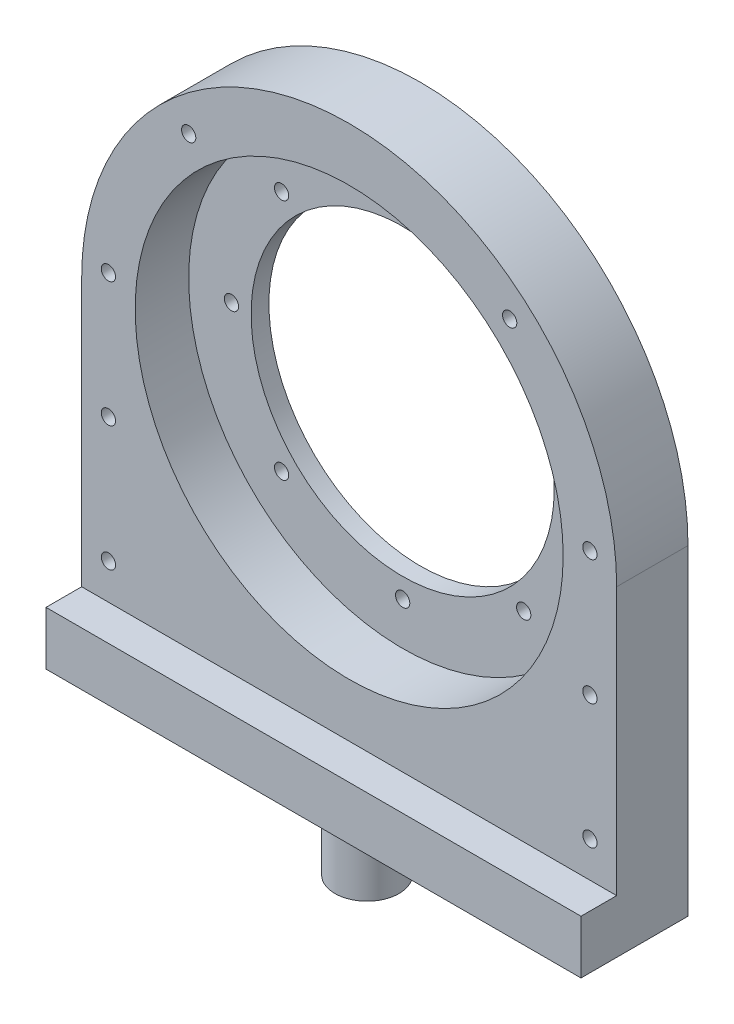
ISO-10303-21;
HEADER;
FILE_DESCRIPTION(('STEP AP214'),'2;1');
FILE_NAME('part.step','',(''),(''),'','','');
FILE_SCHEMA(('AUTOMOTIVE_DESIGN { 1 0 10303 214 1 1 1 1 }'));
ENDSEC;
DATA;
#1=APPLICATION_CONTEXT('core data for automotive mechanical design processes');
#2=APPLICATION_PROTOCOL_DEFINITION('international standard','automotive_design',2000,#1);
#3=PRODUCT_CONTEXT('',#1,'mechanical');
#4=PRODUCT('Part','Part','',(#3));
#5=PRODUCT_RELATED_PRODUCT_CATEGORY('part','',(#4));
#6=PRODUCT_DEFINITION_FORMATION('','',#4);
#7=PRODUCT_DEFINITION_CONTEXT('part definition',#1,'design');
#8=PRODUCT_DEFINITION('design','',#6,#7);
#9=PRODUCT_DEFINITION_SHAPE('','',#8);
#10=(LENGTH_UNIT() NAMED_UNIT(*) SI_UNIT(.MILLI.,.METRE.));
#11=(NAMED_UNIT(*) PLANE_ANGLE_UNIT() SI_UNIT($,.RADIAN.));
#12=(NAMED_UNIT(*) SI_UNIT($,.STERADIAN.) SOLID_ANGLE_UNIT());
#13=UNCERTAINTY_MEASURE_WITH_UNIT(LENGTH_MEASURE(1.E-05),#10,'distance_accuracy_value','');
#14=(GEOMETRIC_REPRESENTATION_CONTEXT(3) GLOBAL_UNCERTAINTY_ASSIGNED_CONTEXT((#13)) GLOBAL_UNIT_ASSIGNED_CONTEXT((#10,
#11,#12)) REPRESENTATION_CONTEXT('',''));
#15=CARTESIAN_POINT('',(0.,0.,0.));
#16=DIRECTION('',(0.,0.,1.));
#17=DIRECTION('',(1.,0.,0.));
#18=AXIS2_PLACEMENT_3D('',#15,#16,#17);
#19=CARTESIAN_POINT('',(75.,75.,-138.281535648995));
#20=DIRECTION('',(0.,0.,1.));
#21=DIRECTION('',(1.,0.,0.));
#22=AXIS2_PLACEMENT_3D('',#19,#20,#21);
#23=CYLINDRICAL_SURFACE('',#22,42.5);
#24=CARTESIAN_POINT('',(75.,75.,-8.2815356489945));
#25=DIRECTION('',(0.,0.,1.));
#26=DIRECTION('',(1.,0.,0.));
#27=AXIS2_PLACEMENT_3D('',#24,#25,#26);
#28=CIRCLE('',#27,42.5);
#29=CARTESIAN_POINT('',(117.5,75.,-8.2815356489945));
#30=VERTEX_POINT('',#29);
#31=EDGE_CURVE('E157',#30,#30,#28,.T.);
#32=ORIENTED_EDGE('',*,*,#31,.F.);
#33=EDGE_LOOP('',(#32));
#34=FACE_BOUND('',#33,.T.);
#35=CARTESIAN_POINT('',(75.,75.,-3.2815356489945));
#36=DIRECTION('',(0.,0.,1.));
#37=DIRECTION('',(1.,0.,0.));
#38=AXIS2_PLACEMENT_3D('',#35,#36,#37);
#39=CIRCLE('',#38,42.5);
#40=CARTESIAN_POINT('',(117.5,75.,-3.2815356489945));
#41=VERTEX_POINT('',#40);
#42=EDGE_CURVE('E89',#41,#41,#39,.F.);
#43=ORIENTED_EDGE('',*,*,#42,.F.);
#44=EDGE_LOOP('',(#43));
#45=FACE_BOUND('',#44,.T.);
#46=ADVANCED_FACE('F85',(#34,#45),#23,.F.);
#47=CARTESIAN_POINT('',(150.,0.,-8.2815356489945));
#48=DIRECTION('',(0.,0.,1.));
#49=DIRECTION('',(1.,0.,0.));
#50=AXIS2_PLACEMENT_3D('',#47,#48,#49);
#51=PLANE('',#50);
#52=CARTESIAN_POINT('',(30.,125.,-8.2815356489945));
#53=DIRECTION('',(0.,0.,1.));
#54=DIRECTION('',(1.,0.,0.));
#55=AXIS2_PLACEMENT_3D('',#52,#53,#54);
#56=CIRCLE('',#55,2.00000000000001);
#57=CARTESIAN_POINT('',(32.,125.,-8.2815356489945));
#58=VERTEX_POINT('',#57);
#59=EDGE_CURVE('E354',#58,#58,#56,.T.);
#60=ORIENTED_EDGE('',*,*,#59,.T.);
#61=EDGE_LOOP('',(#60));
#62=FACE_BOUND('',#61,.T.);
#63=CARTESIAN_POINT('',(120.,125.,-8.2815356489945));
#64=DIRECTION('',(0.,0.,1.));
#65=DIRECTION('',(1.,0.,0.));
#66=AXIS2_PLACEMENT_3D('',#63,#64,#65);
#67=CIRCLE('',#66,2.00000000000001);
#68=CARTESIAN_POINT('',(122.,125.,-8.2815356489945));
#69=VERTEX_POINT('',#68);
#70=EDGE_CURVE('E358',#69,#69,#67,.T.);
#71=ORIENTED_EDGE('',*,*,#70,.T.);
#72=EDGE_LOOP('',(#71));
#73=FACE_BOUND('',#72,.T.);
#74=CARTESIAN_POINT('',(7.49999999999988,45.,-8.2815356489945));
#75=DIRECTION('',(0.,0.,1.));
#76=DIRECTION('',(1.,0.,0.));
#77=AXIS2_PLACEMENT_3D('',#74,#75,#76);
#78=CIRCLE('',#77,2.);
#79=CARTESIAN_POINT('',(9.49999999999988,45.,-8.2815356489945));
#80=VERTEX_POINT('',#79);
#81=EDGE_CURVE('E334',#80,#80,#78,.T.);
#82=ORIENTED_EDGE('',*,*,#81,.T.);
#83=EDGE_LOOP('',(#82));
#84=FACE_BOUND('',#83,.T.);
#85=CARTESIAN_POINT('',(142.5,80.,-8.2815356489945));
#86=DIRECTION('',(0.,0.,1.));
#87=DIRECTION('',(1.,0.,0.));
#88=AXIS2_PLACEMENT_3D('',#85,#86,#87);
#89=CIRCLE('',#88,2.);
#90=CARTESIAN_POINT('',(144.5,80.,-8.2815356489945));
#91=VERTEX_POINT('',#90);
#92=EDGE_CURVE('E343',#91,#91,#89,.T.);
#93=ORIENTED_EDGE('',*,*,#92,.T.);
#94=EDGE_LOOP('',(#93));
#95=FACE_BOUND('',#94,.T.);
#96=CARTESIAN_POINT('',(142.5,45.,-8.2815356489945));
#97=DIRECTION('',(0.,0.,1.));
#98=DIRECTION('',(1.,0.,0.));
#99=AXIS2_PLACEMENT_3D('',#96,#97,#98);
#100=CIRCLE('',#99,2.);
#101=CARTESIAN_POINT('',(144.5,45.,-8.2815356489945));
#102=VERTEX_POINT('',#101);
#103=EDGE_CURVE('E318',#102,#102,#100,.T.);
#104=ORIENTED_EDGE('',*,*,#103,.T.);
#105=EDGE_LOOP('',(#104));
#106=FACE_BOUND('',#105,.T.);
#107=CARTESIAN_POINT('',(142.5,9.99999999999999,-8.2815356489945));
#108=DIRECTION('',(0.,0.,1.));
#109=DIRECTION('',(1.,0.,0.));
#110=AXIS2_PLACEMENT_3D('',#107,#108,#109);
#111=CIRCLE('',#110,2.);
#112=CARTESIAN_POINT('',(144.5,9.99999999999999,-8.2815356489945));
#113=VERTEX_POINT('',#112);
#114=EDGE_CURVE('E327',#113,#113,#111,.T.);
#115=ORIENTED_EDGE('',*,*,#114,.T.);
#116=EDGE_LOOP('',(#115));
#117=FACE_BOUND('',#116,.T.);
#118=CARTESIAN_POINT('',(7.49999999999976,80.,-8.2815356489945));
#119=DIRECTION('',(0.,0.,1.));
#120=DIRECTION('',(1.,0.,0.));
#121=AXIS2_PLACEMENT_3D('',#118,#119,#120);
#122=CIRCLE('',#121,2.);
#123=CARTESIAN_POINT('',(9.49999999999976,80.,-8.2815356489945));
#124=VERTEX_POINT('',#123);
#125=EDGE_CURVE('E350',#124,#124,#122,.T.);
#126=ORIENTED_EDGE('',*,*,#125,.T.);
#127=EDGE_LOOP('',(#126));
#128=FACE_BOUND('',#127,.T.);
#129=CARTESIAN_POINT('',(7.5,9.99999999999999,-8.2815356489945));
#130=DIRECTION('',(0.,0.,1.));
#131=DIRECTION('',(1.,0.,0.));
#132=AXIS2_PLACEMENT_3D('',#129,#130,#131);
#133=CIRCLE('',#132,2.);
#134=CARTESIAN_POINT('',(9.5,9.99999999999999,-8.2815356489945));
#135=VERTEX_POINT('',#134);
#136=EDGE_CURVE('E283',#135,#135,#133,.T.);
#137=ORIENTED_EDGE('',*,*,#136,.T.);
#138=EDGE_LOOP('',(#137));
#139=FACE_BOUND('',#138,.T.);
#140=CARTESIAN_POINT('',(75.,123.,-8.2815356489945));
#141=DIRECTION('',(0.,0.,1.));
#142=DIRECTION('',(1.,0.,0.));
#143=AXIS2_PLACEMENT_3D('',#140,#141,#142);
#144=CIRCLE('',#143,2.);
#145=CARTESIAN_POINT('',(77.,123.,-8.2815356489945));
#146=VERTEX_POINT('',#145);
#147=EDGE_CURVE('E242',#146,#146,#144,.T.);
#148=ORIENTED_EDGE('',*,*,#147,.T.);
#149=EDGE_LOOP('',(#148));
#150=FACE_BOUND('',#149,.T.);
#151=CARTESIAN_POINT('',(108.941125496955,108.941125496956,-8.2815356489945));
#152=DIRECTION('',(0.,0.,1.));
#153=DIRECTION('',(1.,0.,0.));
#154=AXIS2_PLACEMENT_3D('',#151,#152,#153);
#155=CIRCLE('',#154,1.99999999999999);
#156=CARTESIAN_POINT('',(110.941125496955,108.941125496956,-8.2815356489945));
#157=VERTEX_POINT('',#156);
#158=EDGE_CURVE('E249',#157,#157,#155,.T.);
#159=ORIENTED_EDGE('',*,*,#158,.T.);
#160=EDGE_LOOP('',(#159));
#161=FACE_BOUND('',#160,.T.);
#162=CARTESIAN_POINT('',(123.000000000002,75.0000000000023,-8.2815356489945));
#163=DIRECTION('',(0.,0.,1.));
#164=DIRECTION('',(1.,0.,0.));
#165=AXIS2_PLACEMENT_3D('',#162,#163,#164);
#166=CIRCLE('',#165,2.);
#167=CARTESIAN_POINT('',(125.000000000002,75.0000000000023,-8.2815356489945));
#168=VERTEX_POINT('',#167);
#169=EDGE_CURVE('E253',#168,#168,#166,.T.);
#170=ORIENTED_EDGE('',*,*,#169,.T.);
#171=EDGE_LOOP('',(#170));
#172=FACE_BOUND('',#171,.T.);
#173=CARTESIAN_POINT('',(108.941125496958,41.0588745030473,-8.2815356489945));
#174=DIRECTION('',(0.,0.,1.));
#175=DIRECTION('',(1.,0.,0.));
#176=AXIS2_PLACEMENT_3D('',#173,#174,#175);
#177=CIRCLE('',#176,1.99999999999999);
#178=CARTESIAN_POINT('',(110.941125496958,41.0588745030473,-8.2815356489945));
#179=VERTEX_POINT('',#178);
#180=EDGE_CURVE('E257',#179,#179,#177,.T.);
#181=ORIENTED_EDGE('',*,*,#180,.T.);
#182=EDGE_LOOP('',(#181));
#183=FACE_BOUND('',#182,.T.);
#184=CARTESIAN_POINT('',(75.0000000000046,27.,-8.2815356489945));
#185=DIRECTION('',(0.,0.,1.));
#186=DIRECTION('',(1.,0.,0.));
#187=AXIS2_PLACEMENT_3D('',#184,#185,#186);
#188=CIRCLE('',#187,1.99999999999999);
#189=CARTESIAN_POINT('',(77.0000000000046,27.,-8.2815356489945));
#190=VERTEX_POINT('',#189);
#191=EDGE_CURVE('E261',#190,#190,#188,.T.);
#192=ORIENTED_EDGE('',*,*,#191,.T.);
#193=EDGE_LOOP('',(#192));
#194=FACE_BOUND('',#193,.T.);
#195=CARTESIAN_POINT('',(41.0588745030497,41.0588745030443,-8.2815356489945));
#196=DIRECTION('',(0.,0.,1.));
#197=DIRECTION('',(1.,0.,0.));
#198=AXIS2_PLACEMENT_3D('',#195,#196,#197);
#199=CIRCLE('',#198,2.);
#200=CARTESIAN_POINT('',(43.0588745030497,41.0588745030443,-8.2815356489945));
#201=VERTEX_POINT('',#200);
#202=EDGE_CURVE('E265',#201,#201,#199,.T.);
#203=ORIENTED_EDGE('',*,*,#202,.T.);
#204=EDGE_LOOP('',(#203));
#205=FACE_BOUND('',#204,.T.);
#206=CARTESIAN_POINT('',(27.0000000000025,74.999999999998,-8.2815356489945));
#207=DIRECTION('',(0.,0.,1.));
#208=DIRECTION('',(1.,0.,0.));
#209=AXIS2_PLACEMENT_3D('',#206,#207,#208);
#210=CIRCLE('',#209,1.99999999999999);
#211=CARTESIAN_POINT('',(29.0000000000025,74.999999999998,-8.2815356489945));
#212=VERTEX_POINT('',#211);
#213=EDGE_CURVE('E269',#212,#212,#210,.T.);
#214=ORIENTED_EDGE('',*,*,#213,.T.);
#215=EDGE_LOOP('',(#214));
#216=FACE_BOUND('',#215,.T.);
#217=CARTESIAN_POINT('',(41.0588745030469,108.941125496953,-8.2815356489945));
#218=DIRECTION('',(0.,0.,1.));
#219=DIRECTION('',(1.,0.,0.));
#220=AXIS2_PLACEMENT_3D('',#217,#218,#219);
#221=CIRCLE('',#220,2.00000000000001);
#222=CARTESIAN_POINT('',(43.0588745030469,108.941125496953,-8.2815356489945));
#223=VERTEX_POINT('',#222);
#224=EDGE_CURVE('E273',#223,#223,#221,.T.);
#225=ORIENTED_EDGE('',*,*,#224,.T.);
#226=EDGE_LOOP('',(#225));
#227=FACE_BOUND('',#226,.T.);
#228=ORIENTED_EDGE('',*,*,#31,.T.);
#229=EDGE_LOOP('',(#228));
#230=FACE_BOUND('',#229,.T.);
#231=CARTESIAN_POINT('',(75.,75.,-8.2815356489945));
#232=DIRECTION('',(0.,0.,1.));
#233=DIRECTION('',(1.,0.,0.));
#234=AXIS2_PLACEMENT_3D('',#231,#232,#233);
#235=CIRCLE('',#234,75.);
#236=CARTESIAN_POINT('',(150.,75.,-8.2815356489945));
#237=VERTEX_POINT('',#236);
#238=CARTESIAN_POINT('',(0.,75.,-8.2815356489945));
#239=VERTEX_POINT('',#238);
#240=EDGE_CURVE('E171',#237,#239,#235,.T.);
#241=ORIENTED_EDGE('',*,*,#240,.F.);
#242=DIRECTION('',(0.,1.,0.));
#243=VECTOR('',#242,1.);
#244=CARTESIAN_POINT('',(150.,0.,-8.2815356489945));
#245=LINE('',#244,#243);
#246=CARTESIAN_POINT('',(150.,-15.,-8.2815356489945));
#247=VERTEX_POINT('',#246);
#248=EDGE_CURVE('E162',#247,#237,#245,.T.);
#249=ORIENTED_EDGE('',*,*,#248,.F.);
#250=DIRECTION('',(-1.,0.,0.));
#251=VECTOR('',#250,1.);
#252=CARTESIAN_POINT('',(150.,-15.,-8.2815356489945));
#253=LINE('',#252,#251);
#254=CARTESIAN_POINT('',(0.,-15.,-8.2815356489945));
#255=VERTEX_POINT('',#254);
#256=EDGE_CURVE('E215',#247,#255,#253,.T.);
#257=ORIENTED_EDGE('',*,*,#256,.T.);
#258=DIRECTION('',(0.,1.,0.));
#259=VECTOR('',#258,1.);
#260=CARTESIAN_POINT('',(0.,0.,-8.2815356489945));
#261=LINE('',#260,#259);
#262=EDGE_CURVE('E207',#255,#239,#261,.T.);
#263=ORIENTED_EDGE('',*,*,#262,.T.);
#264=EDGE_LOOP('',(#241,#249,#257,#263));
#265=FACE_BOUND('',#264,.T.);
#266=ADVANCED_FACE('F229',(#62,#73,#84,#95,#106,#117,#128,#139,#150,#161,#172,#183,#194,#205,
#216,#227,#230,#265),#51,.F.);
#267=CARTESIAN_POINT('',(0.,150.,11.7184643510055));
#268=DIRECTION('',(0.,0.,-1.));
#269=DIRECTION('',(-1.,0.,0.));
#270=AXIS2_PLACEMENT_3D('',#267,#268,#269);
#271=PLANE('',#270);
#272=CARTESIAN_POINT('',(30.,125.,11.7184643510055));
#273=DIRECTION('',(0.,0.,1.));
#274=DIRECTION('',(1.,0.,0.));
#275=AXIS2_PLACEMENT_3D('',#272,#273,#274);
#276=CIRCLE('',#275,2.00000000000001);
#277=CARTESIAN_POINT('',(32.,125.,11.7184643510055));
#278=VERTEX_POINT('',#277);
#279=EDGE_CURVE('E366',#278,#278,#276,.T.);
#280=ORIENTED_EDGE('',*,*,#279,.F.);
#281=EDGE_LOOP('',(#280));
#282=FACE_BOUND('',#281,.T.);
#283=CARTESIAN_POINT('',(120.,125.,11.7184643510055));
#284=DIRECTION('',(0.,0.,1.));
#285=DIRECTION('',(1.,0.,0.));
#286=AXIS2_PLACEMENT_3D('',#283,#284,#285);
#287=CIRCLE('',#286,2.00000000000001);
#288=CARTESIAN_POINT('',(122.,125.,11.7184643510055));
#289=VERTEX_POINT('',#288);
#290=EDGE_CURVE('E362',#289,#289,#287,.T.);
#291=ORIENTED_EDGE('',*,*,#290,.F.);
#292=EDGE_LOOP('',(#291));
#293=FACE_BOUND('',#292,.T.);
#294=CARTESIAN_POINT('',(7.49999999999988,45.,11.7184643510055));
#295=DIRECTION('',(0.,0.,1.));
#296=DIRECTION('',(1.,0.,0.));
#297=AXIS2_PLACEMENT_3D('',#294,#295,#296);
#298=CIRCLE('',#297,2.);
#299=CARTESIAN_POINT('',(9.49999999999988,45.,11.7184643510055));
#300=VERTEX_POINT('',#299);
#301=EDGE_CURVE('E338',#300,#300,#298,.T.);
#302=ORIENTED_EDGE('',*,*,#301,.F.);
#303=EDGE_LOOP('',(#302));
#304=FACE_BOUND('',#303,.T.);
#305=CARTESIAN_POINT('',(142.5,80.,11.7184643510055));
#306=DIRECTION('',(0.,0.,1.));
#307=DIRECTION('',(1.,0.,0.));
#308=AXIS2_PLACEMENT_3D('',#305,#306,#307);
#309=CIRCLE('',#308,2.);
#310=CARTESIAN_POINT('',(144.5,80.,11.7184643510055));
#311=VERTEX_POINT('',#310);
#312=EDGE_CURVE('E323',#311,#311,#309,.T.);
#313=ORIENTED_EDGE('',*,*,#312,.F.);
#314=EDGE_LOOP('',(#313));
#315=FACE_BOUND('',#314,.T.);
#316=CARTESIAN_POINT('',(142.5,45.,11.7184643510055));
#317=DIRECTION('',(0.,0.,1.));
#318=DIRECTION('',(1.,0.,0.));
#319=AXIS2_PLACEMENT_3D('',#316,#317,#318);
#320=CIRCLE('',#319,2.);
#321=CARTESIAN_POINT('',(144.5,45.,11.7184643510055));
#322=VERTEX_POINT('',#321);
#323=EDGE_CURVE('E322',#322,#322,#320,.T.);
#324=ORIENTED_EDGE('',*,*,#323,.F.);
#325=EDGE_LOOP('',(#324));
#326=FACE_BOUND('',#325,.T.);
#327=CARTESIAN_POINT('',(142.5,9.99999999999999,11.7184643510055));
#328=DIRECTION('',(0.,0.,1.));
#329=DIRECTION('',(1.,0.,0.));
#330=AXIS2_PLACEMENT_3D('',#327,#328,#329);
#331=CIRCLE('',#330,2.);
#332=CARTESIAN_POINT('',(144.5,9.99999999999999,11.7184643510055));
#333=VERTEX_POINT('',#332);
#334=EDGE_CURVE('E314',#333,#333,#331,.T.);
#335=ORIENTED_EDGE('',*,*,#334,.F.);
#336=EDGE_LOOP('',(#335));
#337=FACE_BOUND('',#336,.T.);
#338=CARTESIAN_POINT('',(7.49999999999976,80.,11.7184643510055));
#339=DIRECTION('',(0.,0.,1.));
#340=DIRECTION('',(1.,0.,0.));
#341=AXIS2_PLACEMENT_3D('',#338,#339,#340);
#342=CIRCLE('',#341,2.);
#343=CARTESIAN_POINT('',(9.49999999999976,80.,11.7184643510055));
#344=VERTEX_POINT('',#343);
#345=EDGE_CURVE('E339',#344,#344,#342,.T.);
#346=ORIENTED_EDGE('',*,*,#345,.F.);
#347=EDGE_LOOP('',(#346));
#348=FACE_BOUND('',#347,.T.);
#349=CARTESIAN_POINT('',(7.5,9.99999999999999,11.7184643510055));
#350=DIRECTION('',(0.,0.,1.));
#351=DIRECTION('',(1.,0.,0.));
#352=AXIS2_PLACEMENT_3D('',#349,#350,#351);
#353=CIRCLE('',#352,2.);
#354=CARTESIAN_POINT('',(9.5,9.99999999999999,11.7184643510055));
#355=VERTEX_POINT('',#354);
#356=EDGE_CURVE('E310',#355,#355,#353,.T.);
#357=ORIENTED_EDGE('',*,*,#356,.F.);
#358=EDGE_LOOP('',(#357));
#359=FACE_BOUND('',#358,.T.);
#360=CARTESIAN_POINT('',(75.,75.,11.7184643510055));
#361=DIRECTION('',(0.,0.,1.));
#362=DIRECTION('',(1.,0.,0.));
#363=AXIS2_PLACEMENT_3D('',#360,#361,#362);
#364=CIRCLE('',#363,60.);
#365=CARTESIAN_POINT('',(135.,75.,11.7184643510055));
#366=VERTEX_POINT('',#365);
#367=EDGE_CURVE('E237',#366,#366,#364,.T.);
#368=ORIENTED_EDGE('',*,*,#367,.F.);
#369=EDGE_LOOP('',(#368));
#370=FACE_BOUND('',#369,.T.);
#371=DIRECTION('',(0.,-1.,0.));
#372=VECTOR('',#371,1.);
#373=CARTESIAN_POINT('',(150.,150.,11.7184643510055));
#374=LINE('',#373,#372);
#375=CARTESIAN_POINT('',(150.,75.,11.7184643510055));
#376=VERTEX_POINT('',#375);
#377=CARTESIAN_POINT('',(150.,0.,11.7184643510055));
#378=VERTEX_POINT('',#377);
#379=EDGE_CURVE('E160',#376,#378,#374,.T.);
#380=ORIENTED_EDGE('',*,*,#379,.F.);
#381=CARTESIAN_POINT('',(75.,75.,11.7184643510055));
#382=DIRECTION('',(0.,0.,1.));
#383=DIRECTION('',(1.,0.,0.));
#384=AXIS2_PLACEMENT_3D('',#381,#382,#383);
#385=CIRCLE('',#384,75.);
#386=CARTESIAN_POINT('',(0.,75.,11.7184643510055));
#387=VERTEX_POINT('',#386);
#388=EDGE_CURVE('E150',#376,#387,#385,.T.);
#389=ORIENTED_EDGE('',*,*,#388,.T.);
#390=DIRECTION('',(0.,-1.,0.));
#391=VECTOR('',#390,1.);
#392=CARTESIAN_POINT('',(0.,150.,11.7184643510055));
#393=LINE('',#392,#391);
#394=CARTESIAN_POINT('',(0.,0.,11.7184643510055));
#395=VERTEX_POINT('',#394);
#396=EDGE_CURVE('E102',#387,#395,#393,.T.);
#397=ORIENTED_EDGE('',*,*,#396,.T.);
#398=DIRECTION('',(1.,0.,0.));
#399=VECTOR('',#398,1.);
#400=CARTESIAN_POINT('',(0.,0.,11.7184643510055));
#401=LINE('',#400,#399);
#402=EDGE_CURVE('E164',#395,#378,#401,.T.);
#403=ORIENTED_EDGE('',*,*,#402,.T.);
#404=EDGE_LOOP('',(#380,#389,#397,#403));
#405=FACE_BOUND('',#404,.T.);
#406=ADVANCED_FACE('F163',(#282,#293,#304,#315,#326,#337,#348,#359,#370,#405),#271,.F.);
#407=CARTESIAN_POINT('',(150.,0.,0.));
#408=DIRECTION('',(1.,0.,0.));
#409=DIRECTION('',(0.,0.,-1.));
#410=AXIS2_PLACEMENT_3D('',#407,#408,#409);
#411=PLANE('',#410);
#412=ORIENTED_EDGE('',*,*,#248,.T.);
#413=DIRECTION('',(0.,0.,1.));
#414=VECTOR('',#413,1.);
#415=CARTESIAN_POINT('',(150.,75.,-138.281535648995));
#416=LINE('',#415,#414);
#417=EDGE_CURVE('E12',#237,#376,#416,.T.);
#418=ORIENTED_EDGE('',*,*,#417,.T.);
#419=ORIENTED_EDGE('',*,*,#379,.T.);
#420=DIRECTION('',(0.,0.,1.));
#421=VECTOR('',#420,1.);
#422=CARTESIAN_POINT('',(150.,0.,21.7184643510055));
#423=LINE('',#422,#421);
#424=CARTESIAN_POINT('',(150.,0.,21.7184643510055));
#425=VERTEX_POINT('',#424);
#426=EDGE_CURVE('E111',#378,#425,#423,.T.);
#427=ORIENTED_EDGE('',*,*,#426,.T.);
#428=DIRECTION('',(0.,-1.,0.));
#429=VECTOR('',#428,1.);
#430=CARTESIAN_POINT('',(150.,0.,21.7184643510055));
#431=LINE('',#430,#429);
#432=CARTESIAN_POINT('',(150.,-15.,21.7184643510055));
#433=VERTEX_POINT('',#432);
#434=EDGE_CURVE('E191',#425,#433,#431,.T.);
#435=ORIENTED_EDGE('',*,*,#434,.T.);
#436=DIRECTION('',(0.,0.,-1.));
#437=VECTOR('',#436,1.);
#438=CARTESIAN_POINT('',(150.,-15.,21.7184643510055));
#439=LINE('',#438,#437);
#440=EDGE_CURVE('E134',#433,#247,#439,.T.);
#441=ORIENTED_EDGE('',*,*,#440,.T.);
#442=EDGE_LOOP('',(#412,#418,#419,#427,#435,#441));
#443=FACE_BOUND('',#442,.T.);
#444=ADVANCED_FACE('F159',(#443),#411,.T.);
#445=CARTESIAN_POINT('',(0.,0.,0.));
#446=DIRECTION('',(1.,0.,0.));
#447=DIRECTION('',(0.,0.,-1.));
#448=AXIS2_PLACEMENT_3D('',#445,#446,#447);
#449=PLANE('',#448);
#450=DIRECTION('',(0.,0.,1.));
#451=VECTOR('',#450,1.);
#452=CARTESIAN_POINT('',(0.,75.,-138.281535648995));
#453=LINE('',#452,#451);
#454=EDGE_CURVE('E154',#239,#387,#453,.T.);
#455=ORIENTED_EDGE('',*,*,#454,.F.);
#456=ORIENTED_EDGE('',*,*,#262,.F.);
#457=DIRECTION('',(0.,0.,-1.));
#458=VECTOR('',#457,1.);
#459=CARTESIAN_POINT('',(0.,-15.,21.7184643510055));
#460=LINE('',#459,#458);
#461=CARTESIAN_POINT('',(0.,-15.,21.7184643510055));
#462=VERTEX_POINT('',#461);
#463=EDGE_CURVE('E204',#462,#255,#460,.T.);
#464=ORIENTED_EDGE('',*,*,#463,.F.);
#465=DIRECTION('',(0.,-1.,0.));
#466=VECTOR('',#465,1.);
#467=CARTESIAN_POINT('',(0.,0.,21.7184643510055));
#468=LINE('',#467,#466);
#469=CARTESIAN_POINT('',(0.,0.,21.7184643510055));
#470=VERTEX_POINT('',#469);
#471=EDGE_CURVE('E187',#470,#462,#468,.T.);
#472=ORIENTED_EDGE('',*,*,#471,.F.);
#473=DIRECTION('',(0.,0.,1.));
#474=VECTOR('',#473,1.);
#475=CARTESIAN_POINT('',(0.,0.,21.7184643510055));
#476=LINE('',#475,#474);
#477=EDGE_CURVE('E128',#395,#470,#476,.T.);
#478=ORIENTED_EDGE('',*,*,#477,.F.);
#479=ORIENTED_EDGE('',*,*,#396,.F.);
#480=EDGE_LOOP('',(#455,#456,#464,#472,#478,#479));
#481=FACE_BOUND('',#480,.T.);
#482=ADVANCED_FACE('F226',(#481),#449,.F.);
#483=CARTESIAN_POINT('',(150.,0.,21.7184643510055));
#484=DIRECTION('',(0.,-1.,0.));
#485=DIRECTION('',(0.,0.,-1.));
#486=AXIS2_PLACEMENT_3D('',#483,#484,#485);
#487=PLANE('',#486);
#488=ORIENTED_EDGE('',*,*,#402,.F.);
#489=ORIENTED_EDGE('',*,*,#477,.T.);
#490=DIRECTION('',(-1.,0.,0.));
#491=VECTOR('',#490,1.);
#492=CARTESIAN_POINT('',(150.,0.,21.7184643510055));
#493=LINE('',#492,#491);
#494=EDGE_CURVE('E200',#425,#470,#493,.T.);
#495=ORIENTED_EDGE('',*,*,#494,.F.);
#496=ORIENTED_EDGE('',*,*,#426,.F.);
#497=EDGE_LOOP('',(#488,#489,#495,#496));
#498=FACE_BOUND('',#497,.T.);
#499=ADVANCED_FACE('F450',(#498),#487,.F.);
#500=CARTESIAN_POINT('',(150.,0.,21.7184643510055));
#501=DIRECTION('',(0.,0.,-1.));
#502=DIRECTION('',(0.,1.,0.));
#503=AXIS2_PLACEMENT_3D('',#500,#501,#502);
#504=PLANE('',#503);
#505=ORIENTED_EDGE('',*,*,#471,.T.);
#506=DIRECTION('',(-1.,0.,0.));
#507=VECTOR('',#506,1.);
#508=CARTESIAN_POINT('',(150.,-15.,21.7184643510055));
#509=LINE('',#508,#507);
#510=EDGE_CURVE('E95',#433,#462,#509,.T.);
#511=ORIENTED_EDGE('',*,*,#510,.F.);
#512=ORIENTED_EDGE('',*,*,#434,.F.);
#513=ORIENTED_EDGE('',*,*,#494,.T.);
#514=EDGE_LOOP('',(#505,#511,#512,#513));
#515=FACE_BOUND('',#514,.T.);
#516=ADVANCED_FACE('F87',(#515),#504,.F.);
#517=CARTESIAN_POINT('',(150.,-15.,21.7184643510055));
#518=DIRECTION('',(0.,1.,0.));
#519=DIRECTION('',(0.,0.,1.));
#520=AXIS2_PLACEMENT_3D('',#517,#518,#519);
#521=PLANE('',#520);
#522=CARTESIAN_POINT('',(75.,-15.,6.71846435100549));
#523=DIRECTION('',(0.,-1.,0.));
#524=DIRECTION('',(0.,0.,-1.));
#525=AXIS2_PLACEMENT_3D('',#522,#523,#524);
#526=CIRCLE('',#525,12.7);
#527=CARTESIAN_POINT('',(75.,-15.,-5.98153564899452));
#528=VERTEX_POINT('',#527);
#529=EDGE_CURVE('E179',#528,#528,#526,.T.);
#530=ORIENTED_EDGE('',*,*,#529,.F.);
#531=EDGE_LOOP('',(#530));
#532=FACE_BOUND('',#531,.T.);
#533=ORIENTED_EDGE('',*,*,#463,.T.);
#534=ORIENTED_EDGE('',*,*,#256,.F.);
#535=ORIENTED_EDGE('',*,*,#440,.F.);
#536=ORIENTED_EDGE('',*,*,#510,.T.);
#537=EDGE_LOOP('',(#533,#534,#535,#536));
#538=FACE_BOUND('',#537,.T.);
#539=ADVANCED_FACE('F221',(#532,#538),#521,.F.);
#540=CARTESIAN_POINT('',(75.,-10.,6.71846435100549));
#541=DIRECTION('',(0.,-1.,0.));
#542=DIRECTION('',(0.,0.,-1.));
#543=AXIS2_PLACEMENT_3D('',#540,#541,#542);
#544=CYLINDRICAL_SURFACE('',#543,12.7);
#545=CARTESIAN_POINT('',(75.,-10.,6.71846435100549));
#546=DIRECTION('',(0.,-1.,0.));
#547=DIRECTION('',(0.,0.,-1.));
#548=AXIS2_PLACEMENT_3D('',#545,#546,#547);
#549=CIRCLE('',#548,12.7);
#550=CARTESIAN_POINT('',(75.,-10.,-5.98153564899452));
#551=VERTEX_POINT('',#550);
#552=EDGE_CURVE('E183',#551,#551,#549,.T.);
#553=ORIENTED_EDGE('',*,*,#552,.F.);
#554=EDGE_LOOP('',(#553));
#555=FACE_BOUND('',#554,.T.);
#556=ORIENTED_EDGE('',*,*,#529,.T.);
#557=EDGE_LOOP('',(#556));
#558=FACE_BOUND('',#557,.T.);
#559=ADVANCED_FACE('F441',(#555,#558),#544,.F.);
#560=CARTESIAN_POINT('',(75.,-10.,6.71846435100549));
#561=DIRECTION('',(0.,-1.,0.));
#562=DIRECTION('',(0.,0.,-1.));
#563=AXIS2_PLACEMENT_3D('',#560,#561,#562);
#564=PLANE('',#563);
#565=CARTESIAN_POINT('',(75.,-10.,6.71846435100549));
#566=DIRECTION('',(0.,-1.,0.));
#567=DIRECTION('',(0.,0.,-1.));
#568=AXIS2_PLACEMENT_3D('',#565,#566,#567);
#569=CIRCLE('',#568,9.);
#570=CARTESIAN_POINT('',(75.,-10.,-2.28153564899451));
#571=VERTEX_POINT('',#570);
#572=EDGE_CURVE('E169',#571,#571,#569,.T.);
#573=ORIENTED_EDGE('',*,*,#572,.F.);
#574=EDGE_LOOP('',(#573));
#575=FACE_BOUND('',#574,.T.);
#576=ORIENTED_EDGE('',*,*,#552,.T.);
#577=EDGE_LOOP('',(#576));
#578=FACE_BOUND('',#577,.T.);
#579=ADVANCED_FACE('F437',(#575,#578),#564,.T.);
#580=CARTESIAN_POINT('',(75.,-35.,6.71846435100549));
#581=DIRECTION('',(0.,1.,0.));
#582=DIRECTION('',(0.,0.,1.));
#583=AXIS2_PLACEMENT_3D('',#580,#581,#582);
#584=CYLINDRICAL_SURFACE('',#583,9.);
#585=CARTESIAN_POINT('',(75.,-35.,6.71846435100549));
#586=DIRECTION('',(0.,-1.,0.));
#587=DIRECTION('',(0.,0.,-1.));
#588=AXIS2_PLACEMENT_3D('',#585,#586,#587);
#589=CIRCLE('',#588,9.);
#590=CARTESIAN_POINT('',(75.,-35.,-2.28153564899451));
#591=VERTEX_POINT('',#590);
#592=EDGE_CURVE('E175',#591,#591,#589,.T.);
#593=ORIENTED_EDGE('',*,*,#592,.F.);
#594=EDGE_LOOP('',(#593));
#595=FACE_BOUND('',#594,.T.);
#596=ORIENTED_EDGE('',*,*,#572,.T.);
#597=EDGE_LOOP('',(#596));
#598=FACE_BOUND('',#597,.T.);
#599=ADVANCED_FACE('F433',(#595,#598),#584,.T.);
#600=CARTESIAN_POINT('',(75.,-35.,6.71846435100549));
#601=DIRECTION('',(0.,-1.,0.));
#602=DIRECTION('',(0.,0.,-1.));
#603=AXIS2_PLACEMENT_3D('',#600,#601,#602);
#604=PLANE('',#603);
#605=ORIENTED_EDGE('',*,*,#592,.T.);
#606=EDGE_LOOP('',(#605));
#607=FACE_BOUND('',#606,.T.);
#608=ADVANCED_FACE('F429',(#607),#604,.T.);
#609=CARTESIAN_POINT('',(75.,75.,-138.281535648995));
#610=DIRECTION('',(0.,0.,1.));
#611=DIRECTION('',(1.,0.,0.));
#612=AXIS2_PLACEMENT_3D('',#609,#610,#611);
#613=CYLINDRICAL_SURFACE('',#612,75.);
#614=ORIENTED_EDGE('',*,*,#240,.T.);
#615=ORIENTED_EDGE('',*,*,#454,.T.);
#616=ORIENTED_EDGE('',*,*,#388,.F.);
#617=ORIENTED_EDGE('',*,*,#417,.F.);
#618=EDGE_LOOP('',(#614,#615,#616,#617));
#619=FACE_BOUND('',#618,.T.);
#620=ADVANCED_FACE('F151',(#619),#613,.T.);
#621=CARTESIAN_POINT('',(75.,75.,-3.2815356489945));
#622=DIRECTION('',(0.,0.,1.));
#623=DIRECTION('',(1.,0.,0.));
#624=AXIS2_PLACEMENT_3D('',#621,#622,#623);
#625=PLANE('',#624);
#626=CARTESIAN_POINT('',(75.,123.,-3.2815356489945));
#627=DIRECTION('',(0.,0.,1.));
#628=DIRECTION('',(1.,0.,0.));
#629=AXIS2_PLACEMENT_3D('',#626,#627,#628);
#630=CIRCLE('',#629,2.);
#631=CARTESIAN_POINT('',(77.,123.,-3.2815356489945));
#632=VERTEX_POINT('',#631);
#633=EDGE_CURVE('E277',#632,#632,#630,.T.);
#634=ORIENTED_EDGE('',*,*,#633,.F.);
#635=EDGE_LOOP('',(#634));
#636=FACE_BOUND('',#635,.T.);
#637=CARTESIAN_POINT('',(108.941125496955,108.941125496956,-3.2815356489945));
#638=DIRECTION('',(0.,0.,1.));
#639=DIRECTION('',(1.,0.,0.));
#640=AXIS2_PLACEMENT_3D('',#637,#638,#639);
#641=CIRCLE('',#640,1.99999999999999);
#642=CARTESIAN_POINT('',(110.941125496955,108.941125496956,-3.2815356489945));
#643=VERTEX_POINT('',#642);
#644=EDGE_CURVE('E303',#643,#643,#641,.T.);
#645=ORIENTED_EDGE('',*,*,#644,.F.);
#646=EDGE_LOOP('',(#645));
#647=FACE_BOUND('',#646,.T.);
#648=CARTESIAN_POINT('',(123.000000000002,75.0000000000023,-3.2815356489945));
#649=DIRECTION('',(0.,0.,1.));
#650=DIRECTION('',(1.,0.,0.));
#651=AXIS2_PLACEMENT_3D('',#648,#649,#650);
#652=CIRCLE('',#651,2.);
#653=CARTESIAN_POINT('',(125.000000000002,75.0000000000023,-3.2815356489945));
#654=VERTEX_POINT('',#653);
#655=EDGE_CURVE('E299',#654,#654,#652,.T.);
#656=ORIENTED_EDGE('',*,*,#655,.F.);
#657=EDGE_LOOP('',(#656));
#658=FACE_BOUND('',#657,.T.);
#659=CARTESIAN_POINT('',(108.941125496958,41.0588745030473,-3.2815356489945));
#660=DIRECTION('',(0.,0.,1.));
#661=DIRECTION('',(1.,0.,0.));
#662=AXIS2_PLACEMENT_3D('',#659,#660,#661);
#663=CIRCLE('',#662,1.99999999999999);
#664=CARTESIAN_POINT('',(110.941125496958,41.0588745030473,-3.2815356489945));
#665=VERTEX_POINT('',#664);
#666=EDGE_CURVE('E295',#665,#665,#663,.T.);
#667=ORIENTED_EDGE('',*,*,#666,.F.);
#668=EDGE_LOOP('',(#667));
#669=FACE_BOUND('',#668,.T.);
#670=CARTESIAN_POINT('',(75.0000000000046,27.,-3.2815356489945));
#671=DIRECTION('',(0.,0.,1.));
#672=DIRECTION('',(1.,0.,0.));
#673=AXIS2_PLACEMENT_3D('',#670,#671,#672);
#674=CIRCLE('',#673,1.99999999999999);
#675=CARTESIAN_POINT('',(77.0000000000046,27.,-3.2815356489945));
#676=VERTEX_POINT('',#675);
#677=EDGE_CURVE('E291',#676,#676,#674,.T.);
#678=ORIENTED_EDGE('',*,*,#677,.F.);
#679=EDGE_LOOP('',(#678));
#680=FACE_BOUND('',#679,.T.);
#681=CARTESIAN_POINT('',(41.0588745030497,41.0588745030443,-3.2815356489945));
#682=DIRECTION('',(0.,0.,1.));
#683=DIRECTION('',(1.,0.,0.));
#684=AXIS2_PLACEMENT_3D('',#681,#682,#683);
#685=CIRCLE('',#684,2.);
#686=CARTESIAN_POINT('',(43.0588745030497,41.0588745030443,-3.2815356489945));
#687=VERTEX_POINT('',#686);
#688=EDGE_CURVE('E287',#687,#687,#685,.T.);
#689=ORIENTED_EDGE('',*,*,#688,.F.);
#690=EDGE_LOOP('',(#689));
#691=FACE_BOUND('',#690,.T.);
#692=CARTESIAN_POINT('',(27.0000000000025,74.999999999998,-3.2815356489945));
#693=DIRECTION('',(0.,0.,1.));
#694=DIRECTION('',(1.,0.,0.));
#695=AXIS2_PLACEMENT_3D('',#692,#693,#694);
#696=CIRCLE('',#695,1.99999999999999);
#697=CARTESIAN_POINT('',(29.0000000000025,74.999999999998,-3.2815356489945));
#698=VERTEX_POINT('',#697);
#699=EDGE_CURVE('E282',#698,#698,#696,.T.);
#700=ORIENTED_EDGE('',*,*,#699,.F.);
#701=EDGE_LOOP('',(#700));
#702=FACE_BOUND('',#701,.T.);
#703=CARTESIAN_POINT('',(41.0588745030469,108.941125496953,-3.2815356489945));
#704=DIRECTION('',(0.,0.,1.));
#705=DIRECTION('',(1.,0.,0.));
#706=AXIS2_PLACEMENT_3D('',#703,#704,#705);
#707=CIRCLE('',#706,2.00000000000001);
#708=CARTESIAN_POINT('',(43.0588745030469,108.941125496953,-3.2815356489945));
#709=VERTEX_POINT('',#708);
#710=EDGE_CURVE('E278',#709,#709,#707,.T.);
#711=ORIENTED_EDGE('',*,*,#710,.F.);
#712=EDGE_LOOP('',(#711));
#713=FACE_BOUND('',#712,.T.);
#714=CARTESIAN_POINT('',(75.,75.,-3.2815356489945));
#715=DIRECTION('',(0.,0.,1.));
#716=DIRECTION('',(1.,0.,0.));
#717=AXIS2_PLACEMENT_3D('',#714,#715,#716);
#718=CIRCLE('',#717,60.);
#719=CARTESIAN_POINT('',(135.,75.,-3.2815356489945));
#720=VERTEX_POINT('',#719);
#721=EDGE_CURVE('E241',#720,#720,#718,.T.);
#722=ORIENTED_EDGE('',*,*,#721,.T.);
#723=EDGE_LOOP('',(#722));
#724=FACE_BOUND('',#723,.T.);
#725=ORIENTED_EDGE('',*,*,#42,.T.);
#726=EDGE_LOOP('',(#725));
#727=FACE_BOUND('',#726,.T.);
#728=ADVANCED_FACE('F405',(#636,#647,#658,#669,#680,#691,#702,#713,#724,#727),#625,.T.);
#729=CARTESIAN_POINT('',(75.,75.,-3.2815356489945));
#730=DIRECTION('',(0.,0.,1.));
#731=DIRECTION('',(1.,0.,0.));
#732=AXIS2_PLACEMENT_3D('',#729,#730,#731);
#733=CYLINDRICAL_SURFACE('',#732,60.);
#734=ORIENTED_EDGE('',*,*,#721,.F.);
#735=EDGE_LOOP('',(#734));
#736=FACE_BOUND('',#735,.T.);
#737=ORIENTED_EDGE('',*,*,#367,.T.);
#738=EDGE_LOOP('',(#737));
#739=FACE_BOUND('',#738,.T.);
#740=ADVANCED_FACE('F402',(#736,#739),#733,.F.);
#741=CARTESIAN_POINT('',(41.0588745030469,108.941125496953,-18.2815356489945));
#742=DIRECTION('',(0.,0.,1.));
#743=DIRECTION('',(1.,0.,0.));
#744=AXIS2_PLACEMENT_3D('',#741,#742,#743);
#745=CYLINDRICAL_SURFACE('',#744,2.00000000000001);
#746=ORIENTED_EDGE('',*,*,#710,.T.);
#747=EDGE_LOOP('',(#746));
#748=FACE_BOUND('',#747,.T.);
#749=ORIENTED_EDGE('',*,*,#224,.F.);
#750=EDGE_LOOP('',(#749));
#751=FACE_BOUND('',#750,.T.);
#752=ADVANCED_FACE('F404',(#748,#751),#745,.F.);
#753=CARTESIAN_POINT('',(27.0000000000025,74.999999999998,-18.2815356489945));
#754=DIRECTION('',(0.,0.,1.));
#755=DIRECTION('',(1.,0.,0.));
#756=AXIS2_PLACEMENT_3D('',#753,#754,#755);
#757=CYLINDRICAL_SURFACE('',#756,1.99999999999999);
#758=ORIENTED_EDGE('',*,*,#699,.T.);
#759=EDGE_LOOP('',(#758));
#760=FACE_BOUND('',#759,.T.);
#761=ORIENTED_EDGE('',*,*,#213,.F.);
#762=EDGE_LOOP('',(#761));
#763=FACE_BOUND('',#762,.T.);
#764=ADVANCED_FACE('F412',(#760,#763),#757,.F.);
#765=CARTESIAN_POINT('',(41.0588745030497,41.0588745030443,-18.2815356489945));
#766=DIRECTION('',(0.,0.,1.));
#767=DIRECTION('',(1.,0.,0.));
#768=AXIS2_PLACEMENT_3D('',#765,#766,#767);
#769=CYLINDRICAL_SURFACE('',#768,2.);
#770=ORIENTED_EDGE('',*,*,#688,.T.);
#771=EDGE_LOOP('',(#770));
#772=FACE_BOUND('',#771,.T.);
#773=ORIENTED_EDGE('',*,*,#202,.F.);
#774=EDGE_LOOP('',(#773));
#775=FACE_BOUND('',#774,.T.);
#776=ADVANCED_FACE('F608',(#772,#775),#769,.F.);
#777=CARTESIAN_POINT('',(75.0000000000046,27.,-18.2815356489945));
#778=DIRECTION('',(0.,0.,1.));
#779=DIRECTION('',(1.,0.,0.));
#780=AXIS2_PLACEMENT_3D('',#777,#778,#779);
#781=CYLINDRICAL_SURFACE('',#780,1.99999999999999);
#782=ORIENTED_EDGE('',*,*,#677,.T.);
#783=EDGE_LOOP('',(#782));
#784=FACE_BOUND('',#783,.T.);
#785=ORIENTED_EDGE('',*,*,#191,.F.);
#786=EDGE_LOOP('',(#785));
#787=FACE_BOUND('',#786,.T.);
#788=ADVANCED_FACE('F597',(#784,#787),#781,.F.);
#789=CARTESIAN_POINT('',(108.941125496958,41.0588745030473,-18.2815356489945));
#790=DIRECTION('',(0.,0.,1.));
#791=DIRECTION('',(1.,0.,0.));
#792=AXIS2_PLACEMENT_3D('',#789,#790,#791);
#793=CYLINDRICAL_SURFACE('',#792,1.99999999999999);
#794=ORIENTED_EDGE('',*,*,#666,.T.);
#795=EDGE_LOOP('',(#794));
#796=FACE_BOUND('',#795,.T.);
#797=ORIENTED_EDGE('',*,*,#180,.F.);
#798=EDGE_LOOP('',(#797));
#799=FACE_BOUND('',#798,.T.);
#800=ADVANCED_FACE('F586',(#796,#799),#793,.F.);
#801=CARTESIAN_POINT('',(123.000000000002,75.0000000000023,-18.2815356489945));
#802=DIRECTION('',(0.,0.,1.));
#803=DIRECTION('',(1.,0.,0.));
#804=AXIS2_PLACEMENT_3D('',#801,#802,#803);
#805=CYLINDRICAL_SURFACE('',#804,2.);
#806=ORIENTED_EDGE('',*,*,#655,.T.);
#807=EDGE_LOOP('',(#806));
#808=FACE_BOUND('',#807,.T.);
#809=ORIENTED_EDGE('',*,*,#169,.F.);
#810=EDGE_LOOP('',(#809));
#811=FACE_BOUND('',#810,.T.);
#812=ADVANCED_FACE('F575',(#808,#811),#805,.F.);
#813=CARTESIAN_POINT('',(108.941125496955,108.941125496956,-18.2815356489945));
#814=DIRECTION('',(0.,0.,1.));
#815=DIRECTION('',(1.,0.,0.));
#816=AXIS2_PLACEMENT_3D('',#813,#814,#815);
#817=CYLINDRICAL_SURFACE('',#816,1.99999999999999);
#818=ORIENTED_EDGE('',*,*,#644,.T.);
#819=EDGE_LOOP('',(#818));
#820=FACE_BOUND('',#819,.T.);
#821=ORIENTED_EDGE('',*,*,#158,.F.);
#822=EDGE_LOOP('',(#821));
#823=FACE_BOUND('',#822,.T.);
#824=ADVANCED_FACE('F564',(#820,#823),#817,.F.);
#825=CARTESIAN_POINT('',(75.,123.,-18.2815356489945));
#826=DIRECTION('',(0.,0.,1.));
#827=DIRECTION('',(1.,0.,0.));
#828=AXIS2_PLACEMENT_3D('',#825,#826,#827);
#829=CYLINDRICAL_SURFACE('',#828,2.);
#830=ORIENTED_EDGE('',*,*,#633,.T.);
#831=EDGE_LOOP('',(#830));
#832=FACE_BOUND('',#831,.T.);
#833=ORIENTED_EDGE('',*,*,#147,.F.);
#834=EDGE_LOOP('',(#833));
#835=FACE_BOUND('',#834,.T.);
#836=ADVANCED_FACE('F553',(#832,#835),#829,.F.);
#837=CARTESIAN_POINT('',(7.5,9.99999999999999,-8.2815356489945));
#838=DIRECTION('',(0.,0.,1.));
#839=DIRECTION('',(1.,0.,0.));
#840=AXIS2_PLACEMENT_3D('',#837,#838,#839);
#841=CYLINDRICAL_SURFACE('',#840,2.);
#842=ORIENTED_EDGE('',*,*,#136,.F.);
#843=EDGE_LOOP('',(#842));
#844=FACE_BOUND('',#843,.T.);
#845=ORIENTED_EDGE('',*,*,#356,.T.);
#846=EDGE_LOOP('',(#845));
#847=FACE_BOUND('',#846,.T.);
#848=ADVANCED_FACE('F542',(#844,#847),#841,.F.);
#849=CARTESIAN_POINT('',(7.49999999999976,80.,-8.2815356489945));
#850=DIRECTION('',(0.,0.,1.));
#851=DIRECTION('',(1.,0.,0.));
#852=AXIS2_PLACEMENT_3D('',#849,#850,#851);
#853=CYLINDRICAL_SURFACE('',#852,2.);
#854=ORIENTED_EDGE('',*,*,#125,.F.);
#855=EDGE_LOOP('',(#854));
#856=FACE_BOUND('',#855,.T.);
#857=ORIENTED_EDGE('',*,*,#345,.T.);
#858=EDGE_LOOP('',(#857));
#859=FACE_BOUND('',#858,.T.);
#860=ADVANCED_FACE('F531',(#856,#859),#853,.F.);
#861=CARTESIAN_POINT('',(142.5,9.99999999999999,-8.2815356489945));
#862=DIRECTION('',(0.,0.,1.));
#863=DIRECTION('',(1.,0.,0.));
#864=AXIS2_PLACEMENT_3D('',#861,#862,#863);
#865=CYLINDRICAL_SURFACE('',#864,2.);
#866=ORIENTED_EDGE('',*,*,#114,.F.);
#867=EDGE_LOOP('',(#866));
#868=FACE_BOUND('',#867,.T.);
#869=ORIENTED_EDGE('',*,*,#334,.T.);
#870=EDGE_LOOP('',(#869));
#871=FACE_BOUND('',#870,.T.);
#872=ADVANCED_FACE('F520',(#868,#871),#865,.F.);
#873=CARTESIAN_POINT('',(142.5,45.,-8.2815356489945));
#874=DIRECTION('',(0.,0.,1.));
#875=DIRECTION('',(1.,0.,0.));
#876=AXIS2_PLACEMENT_3D('',#873,#874,#875);
#877=CYLINDRICAL_SURFACE('',#876,2.);
#878=ORIENTED_EDGE('',*,*,#103,.F.);
#879=EDGE_LOOP('',(#878));
#880=FACE_BOUND('',#879,.T.);
#881=ORIENTED_EDGE('',*,*,#323,.T.);
#882=EDGE_LOOP('',(#881));
#883=FACE_BOUND('',#882,.T.);
#884=ADVANCED_FACE('F509',(#880,#883),#877,.F.);
#885=CARTESIAN_POINT('',(142.5,80.,-8.2815356489945));
#886=DIRECTION('',(0.,0.,1.));
#887=DIRECTION('',(1.,0.,0.));
#888=AXIS2_PLACEMENT_3D('',#885,#886,#887);
#889=CYLINDRICAL_SURFACE('',#888,2.);
#890=ORIENTED_EDGE('',*,*,#92,.F.);
#891=EDGE_LOOP('',(#890));
#892=FACE_BOUND('',#891,.T.);
#893=ORIENTED_EDGE('',*,*,#312,.T.);
#894=EDGE_LOOP('',(#893));
#895=FACE_BOUND('',#894,.T.);
#896=ADVANCED_FACE('F496',(#892,#895),#889,.F.);
#897=CARTESIAN_POINT('',(7.49999999999988,45.,-8.2815356489945));
#898=DIRECTION('',(0.,0.,1.));
#899=DIRECTION('',(1.,0.,0.));
#900=AXIS2_PLACEMENT_3D('',#897,#898,#899);
#901=CYLINDRICAL_SURFACE('',#900,2.);
#902=ORIENTED_EDGE('',*,*,#81,.F.);
#903=EDGE_LOOP('',(#902));
#904=FACE_BOUND('',#903,.T.);
#905=ORIENTED_EDGE('',*,*,#301,.T.);
#906=EDGE_LOOP('',(#905));
#907=FACE_BOUND('',#906,.T.);
#908=ADVANCED_FACE('F491',(#904,#907),#901,.F.);
#909=CARTESIAN_POINT('',(120.,125.,-8.2815356489945));
#910=DIRECTION('',(0.,0.,1.));
#911=DIRECTION('',(1.,0.,0.));
#912=AXIS2_PLACEMENT_3D('',#909,#910,#911);
#913=CYLINDRICAL_SURFACE('',#912,2.00000000000001);
#914=ORIENTED_EDGE('',*,*,#70,.F.);
#915=EDGE_LOOP('',(#914));
#916=FACE_BOUND('',#915,.T.);
#917=ORIENTED_EDGE('',*,*,#290,.T.);
#918=EDGE_LOOP('',(#917));
#919=FACE_BOUND('',#918,.T.);
#920=ADVANCED_FACE('F379',(#916,#919),#913,.F.);
#921=CARTESIAN_POINT('',(30.,125.,-8.2815356489945));
#922=DIRECTION('',(0.,0.,1.));
#923=DIRECTION('',(1.,0.,0.));
#924=AXIS2_PLACEMENT_3D('',#921,#922,#923);
#925=CYLINDRICAL_SURFACE('',#924,2.00000000000001);
#926=ORIENTED_EDGE('',*,*,#59,.F.);
#927=EDGE_LOOP('',(#926));
#928=FACE_BOUND('',#927,.T.);
#929=ORIENTED_EDGE('',*,*,#279,.T.);
#930=EDGE_LOOP('',(#929));
#931=FACE_BOUND('',#930,.T.);
#932=ADVANCED_FACE('F376',(#928,#931),#925,.F.);
#933=CLOSED_SHELL('',(#46,#266,#406,#444,#482,#499,#516,#539,#559,#579,#599,#608,#620,#728,#740,
#752,#764,#776,#788,#800,#812,#824,#836,#848,#860,#872,#884,#896,#908,#920,#932));
#934=MANIFOLD_SOLID_BREP('B2',#933);
#935=ADVANCED_BREP_SHAPE_REPRESENTATION('',(#18,#934),#14);
#936=SHAPE_DEFINITION_REPRESENTATION(#9,#935);
ENDSEC;
END-ISO-10303-21;
